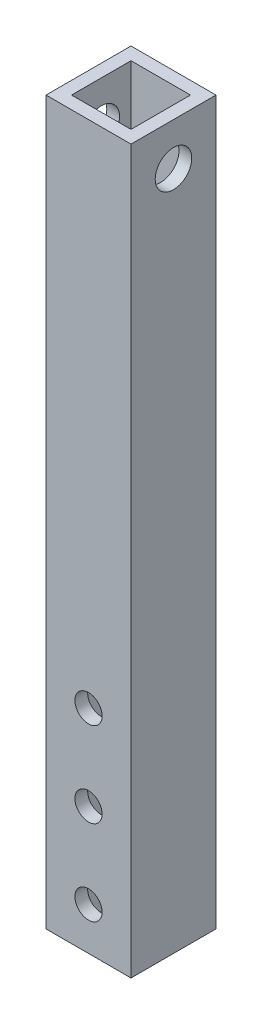
ISO-10303-21;
HEADER;
FILE_DESCRIPTION(('STEP AP214'),'2;1');
FILE_NAME('part.step','',(''),(''),'','','');
FILE_SCHEMA(('AUTOMOTIVE_DESIGN { 1 0 10303 214 1 1 1 1 }'));
ENDSEC;
DATA;
#1=APPLICATION_CONTEXT('core data for automotive mechanical design processes');
#2=APPLICATION_PROTOCOL_DEFINITION('international standard','automotive_design',2000,#1);
#3=PRODUCT_CONTEXT('',#1,'mechanical');
#4=PRODUCT('Part','Part','',(#3));
#5=PRODUCT_RELATED_PRODUCT_CATEGORY('part','',(#4));
#6=PRODUCT_DEFINITION_FORMATION('','',#4);
#7=PRODUCT_DEFINITION_CONTEXT('part definition',#1,'design');
#8=PRODUCT_DEFINITION('design','',#6,#7);
#9=PRODUCT_DEFINITION_SHAPE('','',#8);
#10=(LENGTH_UNIT() NAMED_UNIT(*) SI_UNIT(.MILLI.,.METRE.));
#11=(NAMED_UNIT(*) PLANE_ANGLE_UNIT() SI_UNIT($,.RADIAN.));
#12=(NAMED_UNIT(*) SI_UNIT($,.STERADIAN.) SOLID_ANGLE_UNIT());
#13=UNCERTAINTY_MEASURE_WITH_UNIT(LENGTH_MEASURE(1.E-05),#10,'distance_accuracy_value','');
#14=(GEOMETRIC_REPRESENTATION_CONTEXT(3) GLOBAL_UNCERTAINTY_ASSIGNED_CONTEXT((#13)) GLOBAL_UNIT_ASSIGNED_CONTEXT((#10,
#11,#12)) REPRESENTATION_CONTEXT('',''));
#15=CARTESIAN_POINT('',(0.,0.,0.));
#16=DIRECTION('',(0.,0.,1.));
#17=DIRECTION('',(1.,0.,0.));
#18=AXIS2_PLACEMENT_3D('',#15,#16,#17);
#19=CARTESIAN_POINT('',(0.,85.,0.));
#20=DIRECTION('',(0.,1.,0.));
#21=DIRECTION('',(0.,0.,1.));
#22=AXIS2_PLACEMENT_3D('',#19,#20,#21);
#23=PLANE('',#22);
#24=DIRECTION('',(0.,0.,-1.));
#25=VECTOR('',#24,1.);
#26=CARTESIAN_POINT('',(5.,85.,-5.));
#27=LINE('',#26,#25);
#28=CARTESIAN_POINT('',(5.,85.,5.));
#29=VERTEX_POINT('',#28);
#30=CARTESIAN_POINT('',(5.,85.,-5.));
#31=VERTEX_POINT('',#30);
#32=EDGE_CURVE('E164',#29,#31,#27,.T.);
#33=ORIENTED_EDGE('',*,*,#32,.T.);
#34=DIRECTION('',(-1.,0.,0.));
#35=VECTOR('',#34,1.);
#36=CARTESIAN_POINT('',(-5.,85.,-5.));
#37=LINE('',#36,#35);
#38=CARTESIAN_POINT('',(-5.,85.,-5.));
#39=VERTEX_POINT('',#38);
#40=EDGE_CURVE('E167',#31,#39,#37,.T.);
#41=ORIENTED_EDGE('',*,*,#40,.T.);
#42=DIRECTION('',(0.,0.,1.));
#43=VECTOR('',#42,1.);
#44=CARTESIAN_POINT('',(-5.,85.,-5.));
#45=LINE('',#44,#43);
#46=CARTESIAN_POINT('',(-5.,85.,5.));
#47=VERTEX_POINT('',#46);
#48=EDGE_CURVE('E170',#39,#47,#45,.T.);
#49=ORIENTED_EDGE('',*,*,#48,.T.);
#50=DIRECTION('',(1.,0.,0.));
#51=VECTOR('',#50,1.);
#52=CARTESIAN_POINT('',(-5.,85.,5.));
#53=LINE('',#52,#51);
#54=EDGE_CURVE('E172',#47,#29,#53,.T.);
#55=ORIENTED_EDGE('',*,*,#54,.T.);
#56=EDGE_LOOP('',(#33,#41,#49,#55));
#57=FACE_BOUND('',#56,.T.);
#58=DIRECTION('',(-1.,0.,0.));
#59=VECTOR('',#58,1.);
#60=CARTESIAN_POINT('',(-5.,85.,-3.5));
#61=LINE('',#60,#59);
#62=CARTESIAN_POINT('',(3.5,85.,-3.5));
#63=VERTEX_POINT('',#62);
#64=CARTESIAN_POINT('',(-3.5,85.,-3.5));
#65=VERTEX_POINT('',#64);
#66=EDGE_CURVE('E134',#63,#65,#61,.T.);
#67=ORIENTED_EDGE('',*,*,#66,.F.);
#68=DIRECTION('',(0.,0.,-1.));
#69=VECTOR('',#68,1.);
#70=CARTESIAN_POINT('',(3.5,85.,-5.));
#71=LINE('',#70,#69);
#72=CARTESIAN_POINT('',(3.5,85.,3.5));
#73=VERTEX_POINT('',#72);
#74=EDGE_CURVE('E126',#73,#63,#71,.T.);
#75=ORIENTED_EDGE('',*,*,#74,.F.);
#76=DIRECTION('',(1.,0.,0.));
#77=VECTOR('',#76,1.);
#78=CARTESIAN_POINT('',(-5.,85.,3.5));
#79=LINE('',#78,#77);
#80=CARTESIAN_POINT('',(-3.5,85.,3.5));
#81=VERTEX_POINT('',#80);
#82=EDGE_CURVE('E148',#81,#73,#79,.T.);
#83=ORIENTED_EDGE('',*,*,#82,.F.);
#84=DIRECTION('',(0.,0.,1.));
#85=VECTOR('',#84,1.);
#86=CARTESIAN_POINT('',(-3.5,85.,-5.));
#87=LINE('',#86,#85);
#88=EDGE_CURVE('E146',#65,#81,#87,.T.);
#89=ORIENTED_EDGE('',*,*,#88,.F.);
#90=EDGE_LOOP('',(#67,#75,#83,#89));
#91=FACE_BOUND('',#90,.T.);
#92=ADVANCED_FACE('F59',(#57,#91),#23,.T.);
#93=CARTESIAN_POINT('',(0.,0.,0.));
#94=DIRECTION('',(0.,1.,0.));
#95=DIRECTION('',(0.,0.,1.));
#96=AXIS2_PLACEMENT_3D('',#93,#94,#95);
#97=PLANE('',#96);
#98=DIRECTION('',(0.,0.,-1.));
#99=VECTOR('',#98,1.);
#100=CARTESIAN_POINT('',(5.,0.,-5.));
#101=LINE('',#100,#99);
#102=CARTESIAN_POINT('',(5.,0.,5.));
#103=VERTEX_POINT('',#102);
#104=CARTESIAN_POINT('',(5.,0.,-5.));
#105=VERTEX_POINT('',#104);
#106=EDGE_CURVE('E142',#103,#105,#101,.T.);
#107=ORIENTED_EDGE('',*,*,#106,.F.);
#108=DIRECTION('',(1.,0.,0.));
#109=VECTOR('',#108,1.);
#110=CARTESIAN_POINT('',(-5.,0.,5.));
#111=LINE('',#110,#109);
#112=CARTESIAN_POINT('',(-5.,0.,5.));
#113=VERTEX_POINT('',#112);
#114=EDGE_CURVE('E168',#113,#103,#111,.T.);
#115=ORIENTED_EDGE('',*,*,#114,.F.);
#116=DIRECTION('',(0.,0.,1.));
#117=VECTOR('',#116,1.);
#118=CARTESIAN_POINT('',(-5.,0.,-5.));
#119=LINE('',#118,#117);
#120=CARTESIAN_POINT('',(-5.,0.,-5.));
#121=VERTEX_POINT('',#120);
#122=EDGE_CURVE('E179',#121,#113,#119,.T.);
#123=ORIENTED_EDGE('',*,*,#122,.F.);
#124=DIRECTION('',(-1.,0.,0.));
#125=VECTOR('',#124,1.);
#126=CARTESIAN_POINT('',(-5.,0.,-5.));
#127=LINE('',#126,#125);
#128=EDGE_CURVE('E177',#105,#121,#127,.T.);
#129=ORIENTED_EDGE('',*,*,#128,.F.);
#130=EDGE_LOOP('',(#107,#115,#123,#129));
#131=FACE_BOUND('',#130,.T.);
#132=DIRECTION('',(0.,0.,-1.));
#133=VECTOR('',#132,1.);
#134=CARTESIAN_POINT('',(3.5,0.,-5.));
#135=LINE('',#134,#133);
#136=CARTESIAN_POINT('',(3.5,0.,3.5));
#137=VERTEX_POINT('',#136);
#138=CARTESIAN_POINT('',(3.5,0.,-3.5));
#139=VERTEX_POINT('',#138);
#140=EDGE_CURVE('E84',#137,#139,#135,.T.);
#141=ORIENTED_EDGE('',*,*,#140,.T.);
#142=DIRECTION('',(-1.,0.,0.));
#143=VECTOR('',#142,1.);
#144=CARTESIAN_POINT('',(-5.,0.,-3.5));
#145=LINE('',#144,#143);
#146=CARTESIAN_POINT('',(-3.5,0.,-3.5));
#147=VERTEX_POINT('',#146);
#148=EDGE_CURVE('E141',#139,#147,#145,.T.);
#149=ORIENTED_EDGE('',*,*,#148,.T.);
#150=DIRECTION('',(0.,0.,1.));
#151=VECTOR('',#150,1.);
#152=CARTESIAN_POINT('',(-3.5,0.,-5.));
#153=LINE('',#152,#151);
#154=CARTESIAN_POINT('',(-3.5,0.,3.5));
#155=VERTEX_POINT('',#154);
#156=EDGE_CURVE('E156',#147,#155,#153,.T.);
#157=ORIENTED_EDGE('',*,*,#156,.T.);
#158=DIRECTION('',(1.,0.,0.));
#159=VECTOR('',#158,1.);
#160=CARTESIAN_POINT('',(-5.,0.,3.5));
#161=LINE('',#160,#159);
#162=EDGE_CURVE('E135',#155,#137,#161,.T.);
#163=ORIENTED_EDGE('',*,*,#162,.T.);
#164=EDGE_LOOP('',(#141,#149,#157,#163));
#165=FACE_BOUND('',#164,.T.);
#166=ADVANCED_FACE('F249',(#131,#165),#97,.F.);
#167=CARTESIAN_POINT('',(5.,85.,-5.));
#168=DIRECTION('',(-1.,0.,0.));
#169=DIRECTION('',(0.,0.,1.));
#170=AXIS2_PLACEMENT_3D('',#167,#168,#169);
#171=PLANE('',#170);
#172=CARTESIAN_POINT('',(5.,80.,0.));
#173=DIRECTION('',(1.,0.,0.));
#174=DIRECTION('',(0.,0.,-1.));
#175=AXIS2_PLACEMENT_3D('',#172,#173,#174);
#176=CIRCLE('',#175,2.15);
#177=CARTESIAN_POINT('',(5.,80.,-2.15));
#178=VERTEX_POINT('',#177);
#179=EDGE_CURVE('E229',#178,#178,#176,.T.);
#180=ORIENTED_EDGE('',*,*,#179,.F.);
#181=EDGE_LOOP('',(#180));
#182=FACE_BOUND('',#181,.T.);
#183=ORIENTED_EDGE('',*,*,#106,.T.);
#184=DIRECTION('',(0.,-1.,0.));
#185=VECTOR('',#184,1.);
#186=CARTESIAN_POINT('',(5.,85.,-5.));
#187=LINE('',#186,#185);
#188=EDGE_CURVE('E12',#31,#105,#187,.T.);
#189=ORIENTED_EDGE('',*,*,#188,.F.);
#190=ORIENTED_EDGE('',*,*,#32,.F.);
#191=DIRECTION('',(0.,-1.,0.));
#192=VECTOR('',#191,1.);
#193=CARTESIAN_POINT('',(5.,85.,5.));
#194=LINE('',#193,#192);
#195=EDGE_CURVE('E174',#29,#103,#194,.T.);
#196=ORIENTED_EDGE('',*,*,#195,.T.);
#197=EDGE_LOOP('',(#183,#189,#190,#196));
#198=FACE_BOUND('',#197,.T.);
#199=ADVANCED_FACE('F61',(#182,#198),#171,.F.);
#200=CARTESIAN_POINT('',(-5.,85.,-5.));
#201=DIRECTION('',(0.,0.,1.));
#202=DIRECTION('',(1.,0.,0.));
#203=AXIS2_PLACEMENT_3D('',#200,#201,#202);
#204=PLANE('',#203);
#205=CARTESIAN_POINT('',(0.,25.,-5.));
#206=DIRECTION('',(0.,0.,1.));
#207=DIRECTION('',(1.,0.,0.));
#208=AXIS2_PLACEMENT_3D('',#205,#206,#207);
#209=CIRCLE('',#208,1.6);
#210=CARTESIAN_POINT('',(1.6,25.,-5.));
#211=VERTEX_POINT('',#210);
#212=EDGE_CURVE('E193',#211,#211,#209,.T.);
#213=ORIENTED_EDGE('',*,*,#212,.T.);
#214=EDGE_LOOP('',(#213));
#215=FACE_BOUND('',#214,.T.);
#216=CARTESIAN_POINT('',(0.,5.,-5.));
#217=DIRECTION('',(0.,0.,1.));
#218=DIRECTION('',(1.,0.,0.));
#219=AXIS2_PLACEMENT_3D('',#216,#217,#218);
#220=CIRCLE('',#219,1.6);
#221=CARTESIAN_POINT('',(1.6,5.,-5.));
#222=VERTEX_POINT('',#221);
#223=EDGE_CURVE('E219',#222,#222,#220,.T.);
#224=ORIENTED_EDGE('',*,*,#223,.T.);
#225=EDGE_LOOP('',(#224));
#226=FACE_BOUND('',#225,.T.);
#227=CARTESIAN_POINT('',(0.,15.,-5.));
#228=DIRECTION('',(0.,0.,1.));
#229=DIRECTION('',(1.,0.,0.));
#230=AXIS2_PLACEMENT_3D('',#227,#228,#229);
#231=CIRCLE('',#230,1.6);
#232=CARTESIAN_POINT('',(1.6,15.,-5.));
#233=VERTEX_POINT('',#232);
#234=EDGE_CURVE('E212',#233,#233,#231,.T.);
#235=ORIENTED_EDGE('',*,*,#234,.T.);
#236=EDGE_LOOP('',(#235));
#237=FACE_BOUND('',#236,.T.);
#238=ORIENTED_EDGE('',*,*,#128,.T.);
#239=DIRECTION('',(0.,-1.,0.));
#240=VECTOR('',#239,1.);
#241=CARTESIAN_POINT('',(-5.,85.,-5.));
#242=LINE('',#241,#240);
#243=EDGE_CURVE('E68',#39,#121,#242,.T.);
#244=ORIENTED_EDGE('',*,*,#243,.F.);
#245=ORIENTED_EDGE('',*,*,#40,.F.);
#246=ORIENTED_EDGE('',*,*,#188,.T.);
#247=EDGE_LOOP('',(#238,#244,#245,#246));
#248=FACE_BOUND('',#247,.T.);
#249=ADVANCED_FACE('F279',(#215,#226,#237,#248),#204,.F.);
#250=CARTESIAN_POINT('',(-5.,85.,-5.));
#251=DIRECTION('',(1.,0.,0.));
#252=DIRECTION('',(0.,0.,-1.));
#253=AXIS2_PLACEMENT_3D('',#250,#251,#252);
#254=PLANE('',#253);
#255=CARTESIAN_POINT('',(-5.,80.,0.));
#256=DIRECTION('',(1.,0.,0.));
#257=DIRECTION('',(0.,0.,-1.));
#258=AXIS2_PLACEMENT_3D('',#255,#256,#257);
#259=CIRCLE('',#258,2.15);
#260=CARTESIAN_POINT('',(-5.,80.,-2.15));
#261=VERTEX_POINT('',#260);
#262=EDGE_CURVE('E232',#261,#261,#259,.T.);
#263=ORIENTED_EDGE('',*,*,#262,.T.);
#264=EDGE_LOOP('',(#263));
#265=FACE_BOUND('',#264,.T.);
#266=ORIENTED_EDGE('',*,*,#122,.T.);
#267=DIRECTION('',(0.,-1.,0.));
#268=VECTOR('',#267,1.);
#269=CARTESIAN_POINT('',(-5.,85.,5.));
#270=LINE('',#269,#268);
#271=EDGE_CURVE('E184',#47,#113,#270,.T.);
#272=ORIENTED_EDGE('',*,*,#271,.F.);
#273=ORIENTED_EDGE('',*,*,#48,.F.);
#274=ORIENTED_EDGE('',*,*,#243,.T.);
#275=EDGE_LOOP('',(#266,#272,#273,#274));
#276=FACE_BOUND('',#275,.T.);
#277=ADVANCED_FACE('F276',(#265,#276),#254,.F.);
#278=CARTESIAN_POINT('',(-5.,85.,5.));
#279=DIRECTION('',(0.,0.,-1.));
#280=DIRECTION('',(-1.,0.,0.));
#281=AXIS2_PLACEMENT_3D('',#278,#279,#280);
#282=PLANE('',#281);
#283=CARTESIAN_POINT('',(0.,25.,5.));
#284=DIRECTION('',(0.,0.,1.));
#285=DIRECTION('',(1.,0.,0.));
#286=AXIS2_PLACEMENT_3D('',#283,#284,#285);
#287=CIRCLE('',#286,1.6);
#288=CARTESIAN_POINT('',(1.6,25.,5.));
#289=VERTEX_POINT('',#288);
#290=EDGE_CURVE('E222',#289,#289,#287,.T.);
#291=ORIENTED_EDGE('',*,*,#290,.F.);
#292=EDGE_LOOP('',(#291));
#293=FACE_BOUND('',#292,.T.);
#294=CARTESIAN_POINT('',(0.,5.,5.));
#295=DIRECTION('',(0.,0.,1.));
#296=DIRECTION('',(1.,0.,0.));
#297=AXIS2_PLACEMENT_3D('',#294,#295,#296);
#298=CIRCLE('',#297,1.6);
#299=CARTESIAN_POINT('',(1.6,5.,5.));
#300=VERTEX_POINT('',#299);
#301=EDGE_CURVE('E216',#300,#300,#298,.T.);
#302=ORIENTED_EDGE('',*,*,#301,.F.);
#303=EDGE_LOOP('',(#302));
#304=FACE_BOUND('',#303,.T.);
#305=CARTESIAN_POINT('',(0.,15.,5.));
#306=DIRECTION('',(0.,0.,1.));
#307=DIRECTION('',(1.,0.,0.));
#308=AXIS2_PLACEMENT_3D('',#305,#306,#307);
#309=CIRCLE('',#308,1.6);
#310=CARTESIAN_POINT('',(1.6,15.,5.));
#311=VERTEX_POINT('',#310);
#312=EDGE_CURVE('E209',#311,#311,#309,.T.);
#313=ORIENTED_EDGE('',*,*,#312,.F.);
#314=EDGE_LOOP('',(#313));
#315=FACE_BOUND('',#314,.T.);
#316=ORIENTED_EDGE('',*,*,#114,.T.);
#317=ORIENTED_EDGE('',*,*,#195,.F.);
#318=ORIENTED_EDGE('',*,*,#54,.F.);
#319=ORIENTED_EDGE('',*,*,#271,.T.);
#320=EDGE_LOOP('',(#316,#317,#318,#319));
#321=FACE_BOUND('',#320,.T.);
#322=ADVANCED_FACE('F273',(#293,#304,#315,#321),#282,.F.);
#323=CARTESIAN_POINT('',(3.5,85.,-5.));
#324=DIRECTION('',(-1.,0.,0.));
#325=DIRECTION('',(0.,0.,1.));
#326=AXIS2_PLACEMENT_3D('',#323,#324,#325);
#327=PLANE('',#326);
#328=CARTESIAN_POINT('',(3.5,80.,0.));
#329=DIRECTION('',(-1.,0.,0.));
#330=DIRECTION('',(0.,0.,1.));
#331=AXIS2_PLACEMENT_3D('',#328,#329,#330);
#332=CIRCLE('',#331,2.15);
#333=CARTESIAN_POINT('',(3.5,80.,2.15));
#334=VERTEX_POINT('',#333);
#335=EDGE_CURVE('E213',#334,#334,#332,.T.);
#336=ORIENTED_EDGE('',*,*,#335,.F.);
#337=EDGE_LOOP('',(#336));
#338=FACE_BOUND('',#337,.T.);
#339=ORIENTED_EDGE('',*,*,#140,.F.);
#340=DIRECTION('',(0.,-1.,0.));
#341=VECTOR('',#340,1.);
#342=CARTESIAN_POINT('',(3.5,85.,3.5));
#343=LINE('',#342,#341);
#344=EDGE_CURVE('E130',#73,#137,#343,.T.);
#345=ORIENTED_EDGE('',*,*,#344,.F.);
#346=ORIENTED_EDGE('',*,*,#74,.T.);
#347=DIRECTION('',(0.,-1.,0.));
#348=VECTOR('',#347,1.);
#349=CARTESIAN_POINT('',(3.5,85.,-3.5));
#350=LINE('',#349,#348);
#351=EDGE_CURVE('E129',#63,#139,#350,.T.);
#352=ORIENTED_EDGE('',*,*,#351,.T.);
#353=EDGE_LOOP('',(#339,#345,#346,#352));
#354=FACE_BOUND('',#353,.T.);
#355=ADVANCED_FACE('F128',(#338,#354),#327,.T.);
#356=CARTESIAN_POINT('',(-5.,85.,-3.5));
#357=DIRECTION('',(0.,0.,1.));
#358=DIRECTION('',(1.,0.,0.));
#359=AXIS2_PLACEMENT_3D('',#356,#357,#358);
#360=PLANE('',#359);
#361=CARTESIAN_POINT('',(0.,25.,-3.5));
#362=DIRECTION('',(0.,0.,1.));
#363=DIRECTION('',(1.,0.,0.));
#364=AXIS2_PLACEMENT_3D('',#361,#362,#363);
#365=CIRCLE('',#364,1.6);
#366=CARTESIAN_POINT('',(1.6,25.,-3.5));
#367=VERTEX_POINT('',#366);
#368=EDGE_CURVE('E154',#367,#367,#365,.T.);
#369=ORIENTED_EDGE('',*,*,#368,.F.);
#370=EDGE_LOOP('',(#369));
#371=FACE_BOUND('',#370,.T.);
#372=CARTESIAN_POINT('',(0.,5.,-3.5));
#373=DIRECTION('',(0.,0.,1.));
#374=DIRECTION('',(1.,0.,0.));
#375=AXIS2_PLACEMENT_3D('',#372,#373,#374);
#376=CIRCLE('',#375,1.6);
#377=CARTESIAN_POINT('',(1.6,5.,-3.5));
#378=VERTEX_POINT('',#377);
#379=EDGE_CURVE('E196',#378,#378,#376,.T.);
#380=ORIENTED_EDGE('',*,*,#379,.F.);
#381=EDGE_LOOP('',(#380));
#382=FACE_BOUND('',#381,.T.);
#383=CARTESIAN_POINT('',(0.,15.,-3.5));
#384=DIRECTION('',(0.,0.,1.));
#385=DIRECTION('',(1.,0.,0.));
#386=AXIS2_PLACEMENT_3D('',#383,#384,#385);
#387=CIRCLE('',#386,1.6);
#388=CARTESIAN_POINT('',(1.6,15.,-3.5));
#389=VERTEX_POINT('',#388);
#390=EDGE_CURVE('E192',#389,#389,#387,.T.);
#391=ORIENTED_EDGE('',*,*,#390,.F.);
#392=EDGE_LOOP('',(#391));
#393=FACE_BOUND('',#392,.T.);
#394=ORIENTED_EDGE('',*,*,#148,.F.);
#395=ORIENTED_EDGE('',*,*,#351,.F.);
#396=ORIENTED_EDGE('',*,*,#66,.T.);
#397=DIRECTION('',(0.,-1.,0.));
#398=VECTOR('',#397,1.);
#399=CARTESIAN_POINT('',(-3.5,85.,-3.5));
#400=LINE('',#399,#398);
#401=EDGE_CURVE('E143',#65,#147,#400,.T.);
#402=ORIENTED_EDGE('',*,*,#401,.T.);
#403=EDGE_LOOP('',(#394,#395,#396,#402));
#404=FACE_BOUND('',#403,.T.);
#405=ADVANCED_FACE('F138',(#371,#382,#393,#404),#360,.T.);
#406=CARTESIAN_POINT('',(-3.5,85.,-5.));
#407=DIRECTION('',(1.,0.,0.));
#408=DIRECTION('',(0.,0.,-1.));
#409=AXIS2_PLACEMENT_3D('',#406,#407,#408);
#410=PLANE('',#409);
#411=CARTESIAN_POINT('',(-3.5,80.,0.));
#412=DIRECTION('',(1.,0.,0.));
#413=DIRECTION('',(0.,0.,-1.));
#414=AXIS2_PLACEMENT_3D('',#411,#412,#413);
#415=CIRCLE('',#414,2.15);
#416=CARTESIAN_POINT('',(-3.5,80.,-2.15));
#417=VERTEX_POINT('',#416);
#418=EDGE_CURVE('E63',#417,#417,#415,.T.);
#419=ORIENTED_EDGE('',*,*,#418,.F.);
#420=EDGE_LOOP('',(#419));
#421=FACE_BOUND('',#420,.T.);
#422=ORIENTED_EDGE('',*,*,#156,.F.);
#423=ORIENTED_EDGE('',*,*,#401,.F.);
#424=ORIENTED_EDGE('',*,*,#88,.T.);
#425=DIRECTION('',(0.,-1.,0.));
#426=VECTOR('',#425,1.);
#427=CARTESIAN_POINT('',(-3.5,85.,3.5));
#428=LINE('',#427,#426);
#429=EDGE_CURVE('E76',#81,#155,#428,.T.);
#430=ORIENTED_EDGE('',*,*,#429,.T.);
#431=EDGE_LOOP('',(#422,#423,#424,#430));
#432=FACE_BOUND('',#431,.T.);
#433=ADVANCED_FACE('F242',(#421,#432),#410,.T.);
#434=CARTESIAN_POINT('',(-5.,85.,3.5));
#435=DIRECTION('',(0.,0.,-1.));
#436=DIRECTION('',(-1.,0.,0.));
#437=AXIS2_PLACEMENT_3D('',#434,#435,#436);
#438=PLANE('',#437);
#439=CARTESIAN_POINT('',(0.,25.,3.5));
#440=DIRECTION('',(0.,0.,-1.));
#441=DIRECTION('',(-1.,0.,0.));
#442=AXIS2_PLACEMENT_3D('',#439,#440,#441);
#443=CIRCLE('',#442,1.6);
#444=CARTESIAN_POINT('',(-1.6,25.,3.5));
#445=VERTEX_POINT('',#444);
#446=EDGE_CURVE('E197',#445,#445,#443,.T.);
#447=ORIENTED_EDGE('',*,*,#446,.F.);
#448=EDGE_LOOP('',(#447));
#449=FACE_BOUND('',#448,.T.);
#450=CARTESIAN_POINT('',(0.,5.,3.5));
#451=DIRECTION('',(0.,0.,-1.));
#452=DIRECTION('',(-1.,0.,0.));
#453=AXIS2_PLACEMENT_3D('',#450,#451,#452);
#454=CIRCLE('',#453,1.6);
#455=CARTESIAN_POINT('',(-1.6,5.,3.5));
#456=VERTEX_POINT('',#455);
#457=EDGE_CURVE('E194',#456,#456,#454,.T.);
#458=ORIENTED_EDGE('',*,*,#457,.F.);
#459=EDGE_LOOP('',(#458));
#460=FACE_BOUND('',#459,.T.);
#461=CARTESIAN_POINT('',(0.,15.,3.5));
#462=DIRECTION('',(0.,0.,-1.));
#463=DIRECTION('',(-1.,0.,0.));
#464=AXIS2_PLACEMENT_3D('',#461,#462,#463);
#465=CIRCLE('',#464,1.6);
#466=CARTESIAN_POINT('',(-1.6,15.,3.5));
#467=VERTEX_POINT('',#466);
#468=EDGE_CURVE('E189',#467,#467,#465,.T.);
#469=ORIENTED_EDGE('',*,*,#468,.F.);
#470=EDGE_LOOP('',(#469));
#471=FACE_BOUND('',#470,.T.);
#472=ORIENTED_EDGE('',*,*,#162,.F.);
#473=ORIENTED_EDGE('',*,*,#429,.F.);
#474=ORIENTED_EDGE('',*,*,#82,.T.);
#475=ORIENTED_EDGE('',*,*,#344,.T.);
#476=EDGE_LOOP('',(#472,#473,#474,#475));
#477=FACE_BOUND('',#476,.T.);
#478=ADVANCED_FACE('F245',(#449,#460,#471,#477),#438,.T.);
#479=CARTESIAN_POINT('',(0.,15.,-5.));
#480=DIRECTION('',(0.,0.,1.));
#481=DIRECTION('',(1.,0.,0.));
#482=AXIS2_PLACEMENT_3D('',#479,#480,#481);
#483=CYLINDRICAL_SURFACE('',#482,1.6);
#484=ORIENTED_EDGE('',*,*,#468,.T.);
#485=EDGE_LOOP('',(#484));
#486=FACE_BOUND('',#485,.T.);
#487=ORIENTED_EDGE('',*,*,#312,.T.);
#488=EDGE_LOOP('',(#487));
#489=FACE_BOUND('',#488,.T.);
#490=ADVANCED_FACE('F251',(#486,#489),#483,.F.);
#491=CARTESIAN_POINT('',(0.,5.,-5.));
#492=DIRECTION('',(0.,0.,1.));
#493=DIRECTION('',(1.,0.,0.));
#494=AXIS2_PLACEMENT_3D('',#491,#492,#493);
#495=CYLINDRICAL_SURFACE('',#494,1.6);
#496=ORIENTED_EDGE('',*,*,#457,.T.);
#497=EDGE_LOOP('',(#496));
#498=FACE_BOUND('',#497,.T.);
#499=ORIENTED_EDGE('',*,*,#301,.T.);
#500=EDGE_LOOP('',(#499));
#501=FACE_BOUND('',#500,.T.);
#502=ADVANCED_FACE('F257',(#498,#501),#495,.F.);
#503=CARTESIAN_POINT('',(0.,25.,-5.));
#504=DIRECTION('',(0.,0.,1.));
#505=DIRECTION('',(1.,0.,0.));
#506=AXIS2_PLACEMENT_3D('',#503,#504,#505);
#507=CYLINDRICAL_SURFACE('',#506,1.6);
#508=ORIENTED_EDGE('',*,*,#446,.T.);
#509=EDGE_LOOP('',(#508));
#510=FACE_BOUND('',#509,.T.);
#511=ORIENTED_EDGE('',*,*,#290,.T.);
#512=EDGE_LOOP('',(#511));
#513=FACE_BOUND('',#512,.T.);
#514=ADVANCED_FACE('F308',(#510,#513),#507,.F.);
#515=ORIENTED_EDGE('',*,*,#390,.T.);
#516=EDGE_LOOP('',(#515));
#517=FACE_BOUND('',#516,.T.);
#518=ORIENTED_EDGE('',*,*,#234,.F.);
#519=EDGE_LOOP('',(#518));
#520=FACE_BOUND('',#519,.T.);
#521=ADVANCED_FACE('F260',(#517,#520),#483,.F.);
#522=ORIENTED_EDGE('',*,*,#379,.T.);
#523=EDGE_LOOP('',(#522));
#524=FACE_BOUND('',#523,.T.);
#525=ORIENTED_EDGE('',*,*,#223,.F.);
#526=EDGE_LOOP('',(#525));
#527=FACE_BOUND('',#526,.T.);
#528=ADVANCED_FACE('F307',(#524,#527),#495,.F.);
#529=ORIENTED_EDGE('',*,*,#368,.T.);
#530=EDGE_LOOP('',(#529));
#531=FACE_BOUND('',#530,.T.);
#532=ORIENTED_EDGE('',*,*,#212,.F.);
#533=EDGE_LOOP('',(#532));
#534=FACE_BOUND('',#533,.T.);
#535=ADVANCED_FACE('F314',(#531,#534),#507,.F.);
#536=CARTESIAN_POINT('',(-5.,80.,0.));
#537=DIRECTION('',(1.,0.,0.));
#538=DIRECTION('',(0.,0.,-1.));
#539=AXIS2_PLACEMENT_3D('',#536,#537,#538);
#540=CYLINDRICAL_SURFACE('',#539,2.15);
#541=ORIENTED_EDGE('',*,*,#418,.T.);
#542=EDGE_LOOP('',(#541));
#543=FACE_BOUND('',#542,.T.);
#544=ORIENTED_EDGE('',*,*,#262,.F.);
#545=EDGE_LOOP('',(#544));
#546=FACE_BOUND('',#545,.T.);
#547=ADVANCED_FACE('F239',(#543,#546),#540,.F.);
#548=ORIENTED_EDGE('',*,*,#335,.T.);
#549=EDGE_LOOP('',(#548));
#550=FACE_BOUND('',#549,.T.);
#551=ORIENTED_EDGE('',*,*,#179,.T.);
#552=EDGE_LOOP('',(#551));
#553=FACE_BOUND('',#552,.T.);
#554=ADVANCED_FACE('F321',(#550,#553),#540,.F.);
#555=CLOSED_SHELL('',(#92,#166,#199,#249,#277,#322,#355,#405,#433,#478,#490,#502,#514,#521,#528,
#535,#547,#554));
#556=MANIFOLD_SOLID_BREP('B2',#555);
#557=ADVANCED_BREP_SHAPE_REPRESENTATION('',(#18,#556),#14);
#558=SHAPE_DEFINITION_REPRESENTATION(#9,#557);
ENDSEC;
END-ISO-10303-21;
